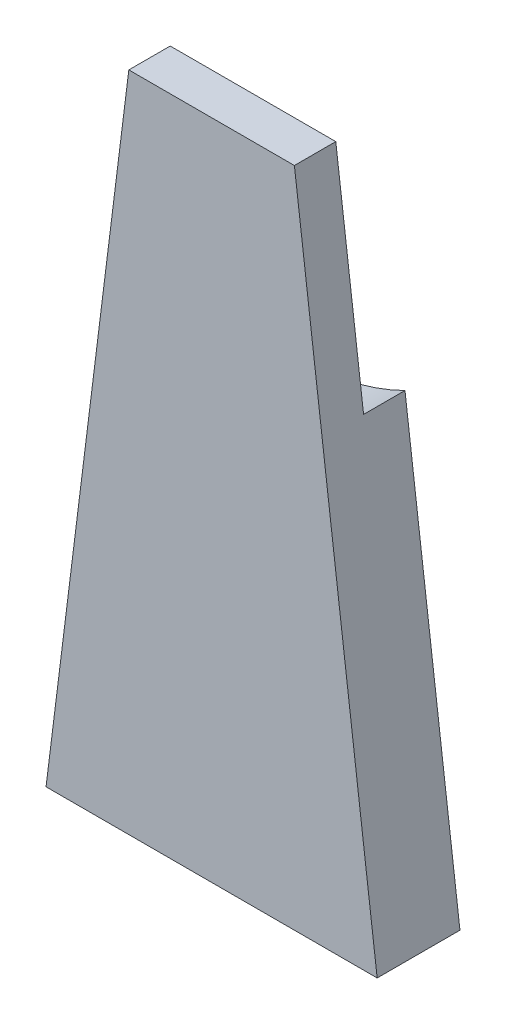
ISO-10303-21;
HEADER;
FILE_DESCRIPTION(('STEP AP214'),'2;1');
FILE_NAME('part.step','',(''),(''),'','','');
FILE_SCHEMA(('AUTOMOTIVE_DESIGN { 1 0 10303 214 1 1 1 1 }'));
ENDSEC;
DATA;
#1=APPLICATION_CONTEXT('core data for automotive mechanical design processes');
#2=APPLICATION_PROTOCOL_DEFINITION('international standard','automotive_design',2000,#1);
#3=PRODUCT_CONTEXT('',#1,'mechanical');
#4=PRODUCT('Part','Part','',(#3));
#5=PRODUCT_RELATED_PRODUCT_CATEGORY('part','',(#4));
#6=PRODUCT_DEFINITION_FORMATION('','',#4);
#7=PRODUCT_DEFINITION_CONTEXT('part definition',#1,'design');
#8=PRODUCT_DEFINITION('design','',#6,#7);
#9=PRODUCT_DEFINITION_SHAPE('','',#8);
#10=(LENGTH_UNIT() NAMED_UNIT(*) SI_UNIT(.MILLI.,.METRE.));
#11=(NAMED_UNIT(*) PLANE_ANGLE_UNIT() SI_UNIT($,.RADIAN.));
#12=(NAMED_UNIT(*) SI_UNIT($,.STERADIAN.) SOLID_ANGLE_UNIT());
#13=UNCERTAINTY_MEASURE_WITH_UNIT(LENGTH_MEASURE(1.E-05),#10,'distance_accuracy_value','');
#14=(GEOMETRIC_REPRESENTATION_CONTEXT(3) GLOBAL_UNCERTAINTY_ASSIGNED_CONTEXT((#13)) GLOBAL_UNIT_ASSIGNED_CONTEXT((#10,
#11,#12)) REPRESENTATION_CONTEXT('',''));
#15=CARTESIAN_POINT('',(0.,0.,0.));
#16=DIRECTION('',(0.,0.,1.));
#17=DIRECTION('',(1.,0.,0.));
#18=AXIS2_PLACEMENT_3D('',#15,#16,#17);
#19=CARTESIAN_POINT('',(0.,0.,0.));
#20=DIRECTION('',(0.,0.,-1.));
#21=DIRECTION('',(-1.,0.,0.));
#22=AXIS2_PLACEMENT_3D('',#19,#20,#21);
#23=PLANE('',#22);
#24=DIRECTION('',(-0.124034734589209,0.992277876713668,0.));
#25=VECTOR('',#24,1.);
#26=CARTESIAN_POINT('',(10.,0.,0.));
#27=LINE('',#26,#25);
#28=CARTESIAN_POINT('',(13.3577576032349,-26.862060825879,0.));
#29=VERTEX_POINT('',#28);
#30=CARTESIAN_POINT('',(10.,0.,0.));
#31=VERTEX_POINT('',#30);
#32=EDGE_CURVE('E137',#29,#31,#27,.T.);
#33=ORIENTED_EDGE('',*,*,#32,.F.);
#34=CARTESIAN_POINT('',(0.,0.,0.));
#35=DIRECTION('',(0.,0.,-1.));
#36=DIRECTION('',(1.,0.,0.));
#37=AXIS2_PLACEMENT_3D('',#34,#35,#36);
#38=CIRCLE('',#37,30.);
#39=CARTESIAN_POINT('',(-13.3577576032349,-26.862060825879,0.));
#40=VERTEX_POINT('',#39);
#41=EDGE_CURVE('E124',#29,#40,#38,.T.);
#42=ORIENTED_EDGE('',*,*,#41,.T.);
#43=DIRECTION('',(-0.124034734589209,-0.992277876713668,0.));
#44=VECTOR('',#43,1.);
#45=CARTESIAN_POINT('',(-10.,0.,0.));
#46=LINE('',#45,#44);
#47=CARTESIAN_POINT('',(-10.,0.,0.));
#48=VERTEX_POINT('',#47);
#49=EDGE_CURVE('E142',#48,#40,#46,.T.);
#50=ORIENTED_EDGE('',*,*,#49,.F.);
#51=DIRECTION('',(-1.,0.,0.));
#52=VECTOR('',#51,1.);
#53=CARTESIAN_POINT('',(-10.,0.,0.));
#54=LINE('',#53,#52);
#55=EDGE_CURVE('E79',#31,#48,#54,.T.);
#56=ORIENTED_EDGE('',*,*,#55,.F.);
#57=EDGE_LOOP('',(#33,#42,#50,#56));
#58=FACE_BOUND('',#57,.T.);
#59=ADVANCED_FACE('F39',(#58),#23,.T.);
#60=CARTESIAN_POINT('',(10.,0.,5.));
#61=DIRECTION('',(-0.992277876713668,-0.124034734589209,0.));
#62=DIRECTION('',(0.124034734589209,-0.992277876713668,0.));
#63=AXIS2_PLACEMENT_3D('',#60,#61,#62);
#64=PLANE('',#63);
#65=DIRECTION('',(0.,0.,-1.));
#66=VECTOR('',#65,1.);
#67=CARTESIAN_POINT('',(20.,-80.,5.));
#68=LINE('',#67,#66);
#69=CARTESIAN_POINT('',(20.,-80.,5.));
#70=VERTEX_POINT('',#69);
#71=CARTESIAN_POINT('',(20.,-80.,-5.));
#72=VERTEX_POINT('',#71);
#73=EDGE_CURVE('E101',#70,#72,#68,.T.);
#74=ORIENTED_EDGE('',*,*,#73,.T.);
#75=DIRECTION('',(-0.124034734589208,0.992277876713668,0.));
#76=VECTOR('',#75,1.);
#77=CARTESIAN_POINT('',(20.,-80.,-5.));
#78=LINE('',#77,#76);
#79=CARTESIAN_POINT('',(13.3577576032349,-26.862060825879,-5.));
#80=VERTEX_POINT('',#79);
#81=EDGE_CURVE('E103',#72,#80,#78,.T.);
#82=ORIENTED_EDGE('',*,*,#81,.T.);
#83=DIRECTION('',(0.,0.,1.));
#84=VECTOR('',#83,1.);
#85=CARTESIAN_POINT('',(13.3577576032349,-26.862060825879,-5.));
#86=LINE('',#85,#84);
#87=EDGE_CURVE('E133',#80,#29,#86,.T.);
#88=ORIENTED_EDGE('',*,*,#87,.T.);
#89=ORIENTED_EDGE('',*,*,#32,.T.);
#90=DIRECTION('',(0.,0.,-1.));
#91=VECTOR('',#90,1.);
#92=CARTESIAN_POINT('',(10.,0.,5.));
#93=LINE('',#92,#91);
#94=CARTESIAN_POINT('',(10.,0.,5.));
#95=VERTEX_POINT('',#94);
#96=EDGE_CURVE('E11',#95,#31,#93,.T.);
#97=ORIENTED_EDGE('',*,*,#96,.F.);
#98=DIRECTION('',(-0.124034734589209,0.992277876713668,0.));
#99=VECTOR('',#98,1.);
#100=CARTESIAN_POINT('',(10.,0.,5.));
#101=LINE('',#100,#99);
#102=EDGE_CURVE('E105',#70,#95,#101,.T.);
#103=ORIENTED_EDGE('',*,*,#102,.F.);
#104=EDGE_LOOP('',(#74,#82,#88,#89,#97,#103));
#105=FACE_BOUND('',#104,.T.);
#106=ADVANCED_FACE('F41',(#105),#64,.F.);
#107=CARTESIAN_POINT('',(-10.,0.,5.));
#108=DIRECTION('',(0.,-1.,0.));
#109=DIRECTION('',(0.,0.,-1.));
#110=AXIS2_PLACEMENT_3D('',#107,#108,#109);
#111=PLANE('',#110);
#112=ORIENTED_EDGE('',*,*,#55,.T.);
#113=DIRECTION('',(0.,0.,-1.));
#114=VECTOR('',#113,1.);
#115=CARTESIAN_POINT('',(-10.,0.,5.));
#116=LINE('',#115,#114);
#117=CARTESIAN_POINT('',(-10.,0.,5.));
#118=VERTEX_POINT('',#117);
#119=EDGE_CURVE('E48',#118,#48,#116,.T.);
#120=ORIENTED_EDGE('',*,*,#119,.F.);
#121=DIRECTION('',(-1.,0.,0.));
#122=VECTOR('',#121,1.);
#123=CARTESIAN_POINT('',(-10.,0.,5.));
#124=LINE('',#123,#122);
#125=EDGE_CURVE('E84',#95,#118,#124,.T.);
#126=ORIENTED_EDGE('',*,*,#125,.F.);
#127=ORIENTED_EDGE('',*,*,#96,.T.);
#128=EDGE_LOOP('',(#112,#120,#126,#127));
#129=FACE_BOUND('',#128,.T.);
#130=ADVANCED_FACE('F166',(#129),#111,.F.);
#131=CARTESIAN_POINT('',(-10.,0.,5.));
#132=DIRECTION('',(0.992277876713668,-0.124034734589209,0.));
#133=DIRECTION('',(0.124034734589209,0.992277876713668,0.));
#134=AXIS2_PLACEMENT_3D('',#131,#132,#133);
#135=PLANE('',#134);
#136=ORIENTED_EDGE('',*,*,#49,.T.);
#137=DIRECTION('',(0.,0.,1.));
#138=VECTOR('',#137,1.);
#139=CARTESIAN_POINT('',(-13.3577576032349,-26.862060825879,-5.));
#140=LINE('',#139,#138);
#141=CARTESIAN_POINT('',(-13.3577576032349,-26.862060825879,-5.));
#142=VERTEX_POINT('',#141);
#143=EDGE_CURVE('E55',#142,#40,#140,.T.);
#144=ORIENTED_EDGE('',*,*,#143,.F.);
#145=DIRECTION('',(-0.124034734589208,-0.992277876713668,0.));
#146=VECTOR('',#145,1.);
#147=CARTESIAN_POINT('',(-13.3577576032349,-26.862060825879,-5.));
#148=LINE('',#147,#146);
#149=CARTESIAN_POINT('',(-20.,-80.,-5.));
#150=VERTEX_POINT('',#149);
#151=EDGE_CURVE('E131',#142,#150,#148,.T.);
#152=ORIENTED_EDGE('',*,*,#151,.T.);
#153=DIRECTION('',(0.,0.,-1.));
#154=VECTOR('',#153,1.);
#155=CARTESIAN_POINT('',(-20.,-80.,5.));
#156=LINE('',#155,#154);
#157=CARTESIAN_POINT('',(-20.,-80.,5.));
#158=VERTEX_POINT('',#157);
#159=EDGE_CURVE('E109',#158,#150,#156,.T.);
#160=ORIENTED_EDGE('',*,*,#159,.F.);
#161=DIRECTION('',(-0.124034734589209,-0.992277876713668,0.));
#162=VECTOR('',#161,1.);
#163=CARTESIAN_POINT('',(-10.,0.,5.));
#164=LINE('',#163,#162);
#165=EDGE_CURVE('E145',#118,#158,#164,.T.);
#166=ORIENTED_EDGE('',*,*,#165,.F.);
#167=ORIENTED_EDGE('',*,*,#119,.T.);
#168=EDGE_LOOP('',(#136,#144,#152,#160,#166,#167));
#169=FACE_BOUND('',#168,.T.);
#170=ADVANCED_FACE('F162',(#169),#135,.F.);
#171=CARTESIAN_POINT('',(20.,-80.,5.));
#172=DIRECTION('',(0.,1.,0.));
#173=DIRECTION('',(0.,0.,1.));
#174=AXIS2_PLACEMENT_3D('',#171,#172,#173);
#175=PLANE('',#174);
#176=ORIENTED_EDGE('',*,*,#159,.T.);
#177=DIRECTION('',(1.,0.,0.));
#178=VECTOR('',#177,1.);
#179=CARTESIAN_POINT('',(-20.,-80.,-5.));
#180=LINE('',#179,#178);
#181=EDGE_CURVE('E116',#150,#72,#180,.T.);
#182=ORIENTED_EDGE('',*,*,#181,.T.);
#183=ORIENTED_EDGE('',*,*,#73,.F.);
#184=DIRECTION('',(1.,0.,0.));
#185=VECTOR('',#184,1.);
#186=CARTESIAN_POINT('',(20.,-80.,5.));
#187=LINE('',#186,#185);
#188=EDGE_CURVE('E64',#158,#70,#187,.T.);
#189=ORIENTED_EDGE('',*,*,#188,.F.);
#190=EDGE_LOOP('',(#176,#182,#183,#189));
#191=FACE_BOUND('',#190,.T.);
#192=ADVANCED_FACE('F121',(#191),#175,.F.);
#193=CARTESIAN_POINT('',(0.,0.,5.));
#194=DIRECTION('',(0.,0.,-1.));
#195=DIRECTION('',(-1.,0.,0.));
#196=AXIS2_PLACEMENT_3D('',#193,#194,#195);
#197=PLANE('',#196);
#198=ORIENTED_EDGE('',*,*,#102,.T.);
#199=ORIENTED_EDGE('',*,*,#125,.T.);
#200=ORIENTED_EDGE('',*,*,#165,.T.);
#201=ORIENTED_EDGE('',*,*,#188,.T.);
#202=EDGE_LOOP('',(#198,#199,#200,#201));
#203=FACE_BOUND('',#202,.T.);
#204=ADVANCED_FACE('F179',(#203),#197,.F.);
#205=CARTESIAN_POINT('',(0.,0.,-5.));
#206=DIRECTION('',(0.,0.,1.));
#207=DIRECTION('',(1.,0.,0.));
#208=AXIS2_PLACEMENT_3D('',#205,#206,#207);
#209=CYLINDRICAL_SURFACE('',#208,30.);
#210=ORIENTED_EDGE('',*,*,#41,.F.);
#211=ORIENTED_EDGE('',*,*,#87,.F.);
#212=CARTESIAN_POINT('',(0.,0.,-5.));
#213=DIRECTION('',(0.,0.,-1.));
#214=DIRECTION('',(1.,0.,0.));
#215=AXIS2_PLACEMENT_3D('',#212,#213,#214);
#216=CIRCLE('',#215,30.);
#217=EDGE_CURVE('E118',#80,#142,#216,.T.);
#218=ORIENTED_EDGE('',*,*,#217,.T.);
#219=ORIENTED_EDGE('',*,*,#143,.T.);
#220=EDGE_LOOP('',(#210,#211,#218,#219));
#221=FACE_BOUND('',#220,.T.);
#222=ADVANCED_FACE('F165',(#221),#209,.F.);
#223=CARTESIAN_POINT('',(0.,0.,-5.));
#224=DIRECTION('',(0.,0.,1.));
#225=DIRECTION('',(1.,0.,0.));
#226=AXIS2_PLACEMENT_3D('',#223,#224,#225);
#227=PLANE('',#226);
#228=ORIENTED_EDGE('',*,*,#181,.F.);
#229=ORIENTED_EDGE('',*,*,#151,.F.);
#230=ORIENTED_EDGE('',*,*,#217,.F.);
#231=ORIENTED_EDGE('',*,*,#81,.F.);
#232=EDGE_LOOP('',(#228,#229,#230,#231));
#233=FACE_BOUND('',#232,.T.);
#234=ADVANCED_FACE('F114',(#233),#227,.F.);
#235=CLOSED_SHELL('',(#59,#106,#130,#170,#192,#204,#222,#234));
#236=MANIFOLD_SOLID_BREP('B2',#235);
#237=ADVANCED_BREP_SHAPE_REPRESENTATION('',(#18,#236),#14);
#238=SHAPE_DEFINITION_REPRESENTATION(#9,#237);
ENDSEC;
END-ISO-10303-21;
